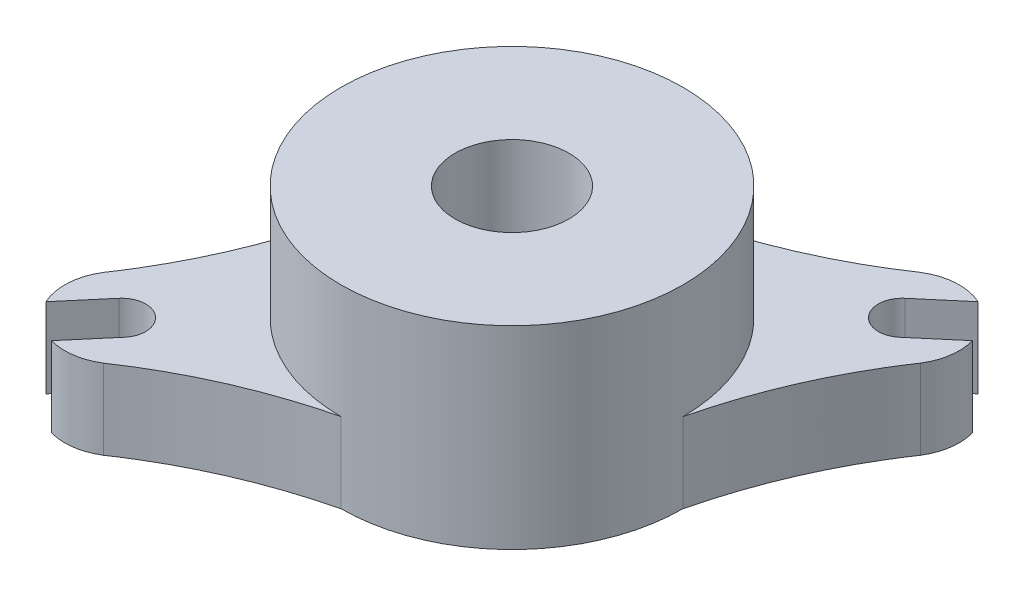
ISO-10303-21;
HEADER;
FILE_DESCRIPTION(('STEP AP214'),'2;1');
FILE_NAME('part.step','',(''),(''),'','','');
FILE_SCHEMA(('AUTOMOTIVE_DESIGN { 1 0 10303 214 1 1 1 1 }'));
ENDSEC;
DATA;
#1=APPLICATION_CONTEXT('core data for automotive mechanical design processes');
#2=APPLICATION_PROTOCOL_DEFINITION('international standard','automotive_design',2000,#1);
#3=PRODUCT_CONTEXT('',#1,'mechanical');
#4=PRODUCT('Part','Part','',(#3));
#5=PRODUCT_RELATED_PRODUCT_CATEGORY('part','',(#4));
#6=PRODUCT_DEFINITION_FORMATION('','',#4);
#7=PRODUCT_DEFINITION_CONTEXT('part definition',#1,'design');
#8=PRODUCT_DEFINITION('design','',#6,#7);
#9=PRODUCT_DEFINITION_SHAPE('','',#8);
#10=(LENGTH_UNIT() NAMED_UNIT(*) SI_UNIT(.MILLI.,.METRE.));
#11=(NAMED_UNIT(*) PLANE_ANGLE_UNIT() SI_UNIT($,.RADIAN.));
#12=(NAMED_UNIT(*) SI_UNIT($,.STERADIAN.) SOLID_ANGLE_UNIT());
#13=UNCERTAINTY_MEASURE_WITH_UNIT(LENGTH_MEASURE(1.E-05),#10,'distance_accuracy_value','');
#14=(GEOMETRIC_REPRESENTATION_CONTEXT(3) GLOBAL_UNCERTAINTY_ASSIGNED_CONTEXT((#13)) GLOBAL_UNIT_ASSIGNED_CONTEXT((#10,
#11,#12)) REPRESENTATION_CONTEXT('',''));
#15=CARTESIAN_POINT('',(0.,0.,0.));
#16=DIRECTION('',(0.,0.,1.));
#17=DIRECTION('',(1.,0.,0.));
#18=AXIS2_PLACEMENT_3D('',#15,#16,#17);
#19=CARTESIAN_POINT('',(0.,0.,0.));
#20=DIRECTION('',(0.,1.,0.));
#21=DIRECTION('',(0.,0.,1.));
#22=AXIS2_PLACEMENT_3D('',#19,#20,#21);
#23=PLANE('',#22);
#24=CARTESIAN_POINT('',(0.,0.,0.));
#25=DIRECTION('',(0.,1.,0.));
#26=DIRECTION('',(0.,0.,1.));
#27=AXIS2_PLACEMENT_3D('',#24,#25,#26);
#28=CIRCLE('',#27,6.35);
#29=CARTESIAN_POINT('',(0.,0.,6.35));
#30=VERTEX_POINT('',#29);
#31=EDGE_CURVE('E256',#30,#30,#28,.T.);
#32=ORIENTED_EDGE('',*,*,#31,.T.);
#33=EDGE_LOOP('',(#32));
#34=FACE_BOUND('',#33,.T.);
#35=DIRECTION('',(-0.647199999999998,0.,0.762320247664984));
#36=VECTOR('',#35,1.);
#37=CARTESIAN_POINT('',(0.125921181269016,0.,0.10690544920843));
#38=LINE('',#37,#36);
#39=CARTESIAN_POINT('',(-19.6991117124648,0.,23.4583022129873));
#40=VERTEX_POINT('',#39);
#41=CARTESIAN_POINT('',(-23.4287816746479,0.,27.8513846129873));
#42=VERTEX_POINT('',#41);
#43=EDGE_CURVE('E151',#40,#42,#38,.T.);
#44=ORIENTED_EDGE('',*,*,#43,.F.);
#45=CARTESIAN_POINT('',(-21.7322198129874,0.,21.7322198129873));
#46=DIRECTION('',(0.,1.,0.));
#47=DIRECTION('',(0.,0.,1.));
#48=AXIS2_PLACEMENT_3D('',#45,#46,#47);
#49=CIRCLE('',#48,2.667);
#50=CARTESIAN_POINT('',(-23.7653279135099,0.,20.0061374129873));
#51=VERTEX_POINT('',#50);
#52=EDGE_CURVE('E163',#40,#51,#49,.T.);
#53=ORIENTED_EDGE('',*,*,#52,.T.);
#54=DIRECTION('',(-0.647199999999998,0.,0.762320247664985));
#55=VECTOR('',#54,1.);
#56=CARTESIAN_POINT('',(-3.94029501977602,0.,-3.34525935079157));
#57=LINE('',#56,#55);
#58=CARTESIAN_POINT('',(-27.4949978756929,0.,24.3992198129874));
#59=VERTEX_POINT('',#58);
#60=EDGE_CURVE('E157',#51,#59,#57,.T.);
#61=ORIENTED_EDGE('',*,*,#60,.T.);
#62=CARTESIAN_POINT('',(-21.7322198129874,0.,21.7322198129873));
#63=DIRECTION('',(0.,1.,0.));
#64=DIRECTION('',(0.,0.,1.));
#65=AXIS2_PLACEMENT_3D('',#62,#63,#64);
#66=CIRCLE('',#65,6.35);
#67=CARTESIAN_POINT('',(-27.124937251061,0.,18.3794450467532));
#68=VERTEX_POINT('',#67);
#69=EDGE_CURVE('E175',#68,#59,#66,.T.);
#70=ORIENTED_EDGE('',*,*,#69,.F.);
#71=CARTESIAN_POINT('',(-19.05,0.,0.));
#72=CARTESIAN_POINT('',(-21.5258002791189,0.,10.0975448852474));
#73=CARTESIAN_POINT('',(-27.124937251061,0.,18.3794450467532));
#74=B_SPLINE_CURVE_WITH_KNOTS('',2,(#71,#72,#73),.UNSPECIFIED.,.F.,.F.,(3,3),(0.,
0.663461898278873),.UNSPECIFIED.);
#75=CARTESIAN_POINT('',(-19.05,0.,0.));
#76=VERTEX_POINT('',#75);
#77=EDGE_CURVE('E230',#76,#68,#74,.T.);
#78=ORIENTED_EDGE('',*,*,#77,.F.);
#79=CARTESIAN_POINT('',(0.,0.,0.));
#80=DIRECTION('',(0.,1.,0.));
#81=DIRECTION('',(0.,0.,1.));
#82=AXIS2_PLACEMENT_3D('',#79,#80,#81);
#83=CIRCLE('',#82,19.05);
#84=CARTESIAN_POINT('',(0.,0.,-19.05));
#85=VERTEX_POINT('',#84);
#86=EDGE_CURVE('E222',#85,#76,#83,.T.);
#87=ORIENTED_EDGE('',*,*,#86,.F.);
#88=CARTESIAN_POINT('',(0.,0.,-19.05));
#89=CARTESIAN_POINT('',(10.0975448852474,0.,-21.5258002791189));
#90=CARTESIAN_POINT('',(18.3794450467532,0.,-27.124937251061));
#91=B_SPLINE_CURVE_WITH_KNOTS('',2,(#88,#89,#90),.UNSPECIFIED.,.F.,.F.,(3,3),(0.,
0.663461898278873),.UNSPECIFIED.);
#92=CARTESIAN_POINT('',(18.3794450467532,0.,-27.124937251061));
#93=VERTEX_POINT('',#92);
#94=EDGE_CURVE('E219',#85,#93,#91,.T.);
#95=ORIENTED_EDGE('',*,*,#94,.T.);
#96=CARTESIAN_POINT('',(21.7322198129873,0.,-21.7322198129874));
#97=DIRECTION('',(0.,1.,0.));
#98=DIRECTION('',(0.,0.,1.));
#99=AXIS2_PLACEMENT_3D('',#96,#97,#98);
#100=CIRCLE('',#99,6.35);
#101=CARTESIAN_POINT('',(24.3992198129873,0.,-27.4949978756929));
#102=VERTEX_POINT('',#101);
#103=EDGE_CURVE('E214',#102,#93,#100,.T.);
#104=ORIENTED_EDGE('',*,*,#103,.F.);
#105=DIRECTION('',(0.762320247664982,0.,-0.647200000000001));
#106=VECTOR('',#105,1.);
#107=CARTESIAN_POINT('',(-3.34525935079151,0.,-3.94029501977592));
#108=LINE('',#107,#106);
#109=CARTESIAN_POINT('',(20.0061374129873,0.,-23.7653279135099));
#110=VERTEX_POINT('',#109);
#111=EDGE_CURVE('E386',#110,#102,#108,.T.);
#112=ORIENTED_EDGE('',*,*,#111,.F.);
#113=CARTESIAN_POINT('',(21.7322198129873,0.,-21.7322198129874));
#114=DIRECTION('',(0.,1.,0.));
#115=DIRECTION('',(0.,0.,1.));
#116=AXIS2_PLACEMENT_3D('',#113,#114,#115);
#117=CIRCLE('',#116,2.667);
#118=CARTESIAN_POINT('',(23.4583022129873,0.,-19.6991117124649));
#119=VERTEX_POINT('',#118);
#120=EDGE_CURVE('E169',#110,#119,#117,.T.);
#121=ORIENTED_EDGE('',*,*,#120,.T.);
#122=DIRECTION('',(-0.762320247664981,0.,0.647200000000002));
#123=VECTOR('',#122,1.);
#124=CARTESIAN_POINT('',(0.106905449208518,0.,0.125921181269117));
#125=LINE('',#124,#123);
#126=CARTESIAN_POINT('',(27.8513846129873,0.,-23.4287816746479));
#127=VERTEX_POINT('',#126);
#128=EDGE_CURVE('E218',#127,#119,#125,.T.);
#129=ORIENTED_EDGE('',*,*,#128,.F.);
#130=CARTESIAN_POINT('',(27.124937251061,0.,-18.3794450467533));
#131=VERTEX_POINT('',#130);
#132=EDGE_CURVE('E203',#131,#127,#100,.T.);
#133=ORIENTED_EDGE('',*,*,#132,.F.);
#134=CARTESIAN_POINT('',(19.0499999999999,0.,0.));
#135=CARTESIAN_POINT('',(21.5258002791189,0.,-10.0975448852475));
#136=CARTESIAN_POINT('',(27.124937251061,0.,-18.3794450467533));
#137=B_SPLINE_CURVE_WITH_KNOTS('',2,(#134,#135,#136),.UNSPECIFIED.,.F.,.F.,(3,3),(0.,
0.663461898278873),.UNSPECIFIED.);
#138=CARTESIAN_POINT('',(19.05,0.,0.));
#139=VERTEX_POINT('',#138);
#140=EDGE_CURVE('E209',#139,#131,#137,.T.);
#141=ORIENTED_EDGE('',*,*,#140,.F.);
#142=CARTESIAN_POINT('',(0.,0.,19.05));
#143=VERTEX_POINT('',#142);
#144=EDGE_CURVE('E215',#143,#139,#83,.T.);
#145=ORIENTED_EDGE('',*,*,#144,.F.);
#146=CARTESIAN_POINT('',(0.,0.,19.0499999999999));
#147=CARTESIAN_POINT('',(-10.0975448852475,0.,21.5258002791188));
#148=CARTESIAN_POINT('',(-18.3794450467532,0.,27.1249372510609));
#149=B_SPLINE_CURVE_WITH_KNOTS('',2,(#146,#147,#148),.UNSPECIFIED.,.F.,.F.,(3,3),(0.,
0.663461898278873),.UNSPECIFIED.);
#150=CARTESIAN_POINT('',(-18.3794450467532,0.,27.124937251061));
#151=VERTEX_POINT('',#150);
#152=EDGE_CURVE('E170',#143,#151,#149,.T.);
#153=ORIENTED_EDGE('',*,*,#152,.T.);
#154=EDGE_CURVE('E165',#42,#151,#66,.T.);
#155=ORIENTED_EDGE('',*,*,#154,.F.);
#156=EDGE_LOOP('',(#44,#53,#61,#70,#78,#87,#95,#104,#112,#121,#129,#133,#141,#145,#153,#155));
#157=FACE_BOUND('',#156,.T.);
#158=ADVANCED_FACE('F38',(#34,#157),#23,.F.);
#159=CARTESIAN_POINT('',(-21.7322198129874,21.59,21.7322198129873));
#160=DIRECTION('',(0.,-1.,0.));
#161=DIRECTION('',(0.,0.,-1.));
#162=AXIS2_PLACEMENT_3D('',#159,#160,#161);
#163=CYLINDRICAL_SURFACE('',#162,6.35);
#164=DIRECTION('',(0.,1.,0.));
#165=VECTOR('',#164,1.);
#166=CARTESIAN_POINT('',(-23.4287816746479,0.,27.8513846129873));
#167=LINE('',#166,#165);
#168=CARTESIAN_POINT('',(-23.4287816746479,8.89,27.8513846129873));
#169=VERTEX_POINT('',#168);
#170=EDGE_CURVE('E61',#42,#169,#167,.T.);
#171=ORIENTED_EDGE('',*,*,#170,.F.);
#172=ORIENTED_EDGE('',*,*,#154,.T.);
#173=DIRECTION('',(0.,-1.,0.));
#174=VECTOR('',#173,1.);
#175=CARTESIAN_POINT('',(-18.3794450467532,21.59,27.124937251061));
#176=LINE('',#175,#174);
#177=CARTESIAN_POINT('',(-18.3794450467532,8.89,27.1249372510609));
#178=VERTEX_POINT('',#177);
#179=EDGE_CURVE('E183',#178,#151,#176,.T.);
#180=ORIENTED_EDGE('',*,*,#179,.F.);
#181=CARTESIAN_POINT('',(-21.7322198129874,8.89,21.7322198129873));
#182=DIRECTION('',(0.,1.,0.));
#183=DIRECTION('',(0.,0.,1.));
#184=AXIS2_PLACEMENT_3D('',#181,#182,#183);
#185=CIRCLE('',#184,6.35);
#186=EDGE_CURVE('E276',#169,#178,#185,.T.);
#187=ORIENTED_EDGE('',*,*,#186,.F.);
#188=EDGE_LOOP('',(#171,#172,#180,#187));
#189=FACE_BOUND('',#188,.T.);
#190=ADVANCED_FACE('F246',(#189),#163,.T.);
#191=CARTESIAN_POINT('',(0.,8.89,0.));
#192=DIRECTION('',(0.,1.,0.));
#193=DIRECTION('',(0.,0.,1.));
#194=AXIS2_PLACEMENT_3D('',#191,#192,#193);
#195=PLANE('',#194);
#196=CARTESIAN_POINT('',(-21.7322198129874,8.89,21.7322198129873));
#197=DIRECTION('',(0.,1.,0.));
#198=DIRECTION('',(0.,0.,1.));
#199=AXIS2_PLACEMENT_3D('',#196,#197,#198);
#200=CIRCLE('',#199,2.667);
#201=CARTESIAN_POINT('',(-23.7653279135099,8.89,20.0061374129873));
#202=VERTEX_POINT('',#201);
#203=CARTESIAN_POINT('',(-19.6991117124648,8.89,23.4583022129873));
#204=VERTEX_POINT('',#203);
#205=EDGE_CURVE('E258',#202,#204,#200,.F.);
#206=ORIENTED_EDGE('',*,*,#205,.T.);
#207=DIRECTION('',(-0.647199999999998,0.,0.762320247664984));
#208=VECTOR('',#207,1.);
#209=CARTESIAN_POINT('',(0.125921181269016,8.89,0.10690544920843));
#210=LINE('',#209,#208);
#211=EDGE_CURVE('E152',#204,#169,#210,.T.);
#212=ORIENTED_EDGE('',*,*,#211,.T.);
#213=ORIENTED_EDGE('',*,*,#186,.T.);
#214=CARTESIAN_POINT('',(-18.3794450467532,8.89,27.1249372510609));
#215=CARTESIAN_POINT('',(-10.0975448852475,8.89,21.5258002791188));
#216=CARTESIAN_POINT('',(0.,8.89,19.0499999999999));
#217=B_SPLINE_CURVE_WITH_KNOTS('',2,(#214,#215,#216),.UNSPECIFIED.,.F.,.F.,(3,3),(0.,
0.663461898278873),.UNSPECIFIED.);
#218=CARTESIAN_POINT('',(0.,8.89,19.0499999999999));
#219=VERTEX_POINT('',#218);
#220=EDGE_CURVE('E254',#178,#219,#217,.T.);
#221=ORIENTED_EDGE('',*,*,#220,.T.);
#222=CARTESIAN_POINT('',(0.,8.89,0.));
#223=DIRECTION('',(0.,1.,0.));
#224=DIRECTION('',(0.,0.,1.));
#225=AXIS2_PLACEMENT_3D('',#222,#223,#224);
#226=CIRCLE('',#225,19.05);
#227=CARTESIAN_POINT('',(-19.05,8.89,0.));
#228=VERTEX_POINT('',#227);
#229=EDGE_CURVE('E277',#228,#219,#226,.T.);
#230=ORIENTED_EDGE('',*,*,#229,.F.);
#231=CARTESIAN_POINT('',(-19.05,8.89,0.));
#232=CARTESIAN_POINT('',(-21.5258002791189,8.89,10.0975448852474));
#233=CARTESIAN_POINT('',(-27.124937251061,8.89,18.3794450467532));
#234=B_SPLINE_CURVE_WITH_KNOTS('',2,(#231,#232,#233),.UNSPECIFIED.,.F.,.F.,(3,3),(0.,
0.663461898278873),.UNSPECIFIED.);
#235=CARTESIAN_POINT('',(-27.124937251061,8.89,18.3794450467532));
#236=VERTEX_POINT('',#235);
#237=EDGE_CURVE('E272',#228,#236,#234,.T.);
#238=ORIENTED_EDGE('',*,*,#237,.T.);
#239=CARTESIAN_POINT('',(-27.4949978756929,8.89,24.3992198129874));
#240=VERTEX_POINT('',#239);
#241=EDGE_CURVE('E279',#236,#240,#185,.T.);
#242=ORIENTED_EDGE('',*,*,#241,.T.);
#243=DIRECTION('',(-0.647199999999998,0.,0.762320247664985));
#244=VECTOR('',#243,1.);
#245=CARTESIAN_POINT('',(-3.94029501977602,8.89,-3.34525935079157));
#246=LINE('',#245,#244);
#247=EDGE_CURVE('E166',#202,#240,#246,.T.);
#248=ORIENTED_EDGE('',*,*,#247,.F.);
#249=EDGE_LOOP('',(#206,#212,#213,#221,#230,#238,#242,#248));
#250=FACE_BOUND('',#249,.T.);
#251=ADVANCED_FACE('F319',(#250),#195,.T.);
#252=CARTESIAN_POINT('',(21.7322198129873,21.59,-21.7322198129874));
#253=DIRECTION('',(0.,-1.,0.));
#254=DIRECTION('',(0.,0.,-1.));
#255=AXIS2_PLACEMENT_3D('',#252,#253,#254);
#256=CYLINDRICAL_SURFACE('',#255,6.35);
#257=DIRECTION('',(0.,1.,0.));
#258=VECTOR('',#257,1.);
#259=CARTESIAN_POINT('',(27.8513846129873,0.,-23.4287816746479));
#260=LINE('',#259,#258);
#261=CARTESIAN_POINT('',(27.8513846129873,8.89,-23.4287816746479));
#262=VERTEX_POINT('',#261);
#263=EDGE_CURVE('E389',#127,#262,#260,.T.);
#264=ORIENTED_EDGE('',*,*,#263,.T.);
#265=CARTESIAN_POINT('',(21.7322198129873,8.89,-21.7322198129874));
#266=DIRECTION('',(0.,1.,0.));
#267=DIRECTION('',(0.,0.,1.));
#268=AXIS2_PLACEMENT_3D('',#265,#266,#267);
#269=CIRCLE('',#268,6.35);
#270=CARTESIAN_POINT('',(27.124937251061,8.89,-18.3794450467533));
#271=VERTEX_POINT('',#270);
#272=EDGE_CURVE('E205',#271,#262,#269,.T.);
#273=ORIENTED_EDGE('',*,*,#272,.F.);
#274=DIRECTION('',(0.,-1.,0.));
#275=VECTOR('',#274,1.);
#276=CARTESIAN_POINT('',(27.124937251061,21.59,-18.3794450467533));
#277=LINE('',#276,#275);
#278=EDGE_CURVE('E46',#271,#131,#277,.T.);
#279=ORIENTED_EDGE('',*,*,#278,.T.);
#280=ORIENTED_EDGE('',*,*,#132,.T.);
#281=EDGE_LOOP('',(#264,#273,#279,#280));
#282=FACE_BOUND('',#281,.T.);
#283=ADVANCED_FACE('F201',(#282),#256,.T.);
#284=DIRECTION('',(0.,1.,0.));
#285=VECTOR('',#284,1.);
#286=CARTESIAN_POINT('',(24.3992198129873,0.,-27.4949978756929));
#287=LINE('',#286,#285);
#288=CARTESIAN_POINT('',(24.3992198129873,8.89,-27.4949978756929));
#289=VERTEX_POINT('',#288);
#290=EDGE_CURVE('E400',#102,#289,#287,.T.);
#291=ORIENTED_EDGE('',*,*,#290,.F.);
#292=ORIENTED_EDGE('',*,*,#103,.T.);
#293=DIRECTION('',(0.,-1.,0.));
#294=VECTOR('',#293,1.);
#295=CARTESIAN_POINT('',(18.3794450467532,21.59,-27.124937251061));
#296=LINE('',#295,#294);
#297=CARTESIAN_POINT('',(18.3794450467532,8.89,-27.124937251061));
#298=VERTEX_POINT('',#297);
#299=EDGE_CURVE('E193',#298,#93,#296,.T.);
#300=ORIENTED_EDGE('',*,*,#299,.F.);
#301=EDGE_CURVE('E408',#289,#298,#269,.T.);
#302=ORIENTED_EDGE('',*,*,#301,.F.);
#303=EDGE_LOOP('',(#291,#292,#300,#302));
#304=FACE_BOUND('',#303,.T.);
#305=ADVANCED_FACE('F318',(#304),#256,.T.);
#306=CARTESIAN_POINT('',(21.7322198129873,21.59,-21.7322198129874));
#307=DIRECTION('',(0.,-1.,0.));
#308=DIRECTION('',(0.,0.,-1.));
#309=AXIS2_PLACEMENT_3D('',#306,#307,#308);
#310=CYLINDRICAL_SURFACE('',#309,2.667);
#311=CARTESIAN_POINT('',(21.7322198129873,8.89,-21.7322198129874));
#312=DIRECTION('',(0.,1.,0.));
#313=DIRECTION('',(0.,0.,1.));
#314=AXIS2_PLACEMENT_3D('',#311,#312,#313);
#315=CIRCLE('',#314,2.667);
#316=CARTESIAN_POINT('',(23.4583022129873,8.89,-19.6991117124649));
#317=VERTEX_POINT('',#316);
#318=CARTESIAN_POINT('',(20.0061374129873,8.89,-23.7653279135099));
#319=VERTEX_POINT('',#318);
#320=EDGE_CURVE('E281',#317,#319,#315,.F.);
#321=ORIENTED_EDGE('',*,*,#320,.F.);
#322=DIRECTION('',(0.,1.,0.));
#323=VECTOR('',#322,1.);
#324=CARTESIAN_POINT('',(23.4583022129873,0.,-19.6991117124649));
#325=LINE('',#324,#323);
#326=EDGE_CURVE('E394',#119,#317,#325,.T.);
#327=ORIENTED_EDGE('',*,*,#326,.F.);
#328=ORIENTED_EDGE('',*,*,#120,.F.);
#329=DIRECTION('',(0.,1.,0.));
#330=VECTOR('',#329,1.);
#331=CARTESIAN_POINT('',(20.0061374129873,0.,-23.7653279135099));
#332=LINE('',#331,#330);
#333=EDGE_CURVE('E397',#110,#319,#332,.T.);
#334=ORIENTED_EDGE('',*,*,#333,.T.);
#335=EDGE_LOOP('',(#321,#327,#328,#334));
#336=FACE_BOUND('',#335,.T.);
#337=ADVANCED_FACE('F346',(#336),#310,.F.);
#338=CARTESIAN_POINT('',(0.,8.89,0.));
#339=DIRECTION('',(0.,1.,0.));
#340=DIRECTION('',(0.,0.,1.));
#341=AXIS2_PLACEMENT_3D('',#338,#339,#340);
#342=PLANE('',#341);
#343=ORIENTED_EDGE('',*,*,#272,.T.);
#344=DIRECTION('',(-0.762320247664981,0.,0.647200000000002));
#345=VECTOR('',#344,1.);
#346=CARTESIAN_POINT('',(0.106905449208518,8.89,0.125921181269117));
#347=LINE('',#346,#345);
#348=EDGE_CURVE('E382',#262,#317,#347,.T.);
#349=ORIENTED_EDGE('',*,*,#348,.T.);
#350=ORIENTED_EDGE('',*,*,#320,.T.);
#351=DIRECTION('',(0.762320247664982,0.,-0.647200000000001));
#352=VECTOR('',#351,1.);
#353=CARTESIAN_POINT('',(-3.34525935079151,8.89,-3.94029501977592));
#354=LINE('',#353,#352);
#355=EDGE_CURVE('E387',#319,#289,#354,.T.);
#356=ORIENTED_EDGE('',*,*,#355,.T.);
#357=ORIENTED_EDGE('',*,*,#301,.T.);
#358=CARTESIAN_POINT('',(18.3794450467532,8.89,-27.124937251061));
#359=CARTESIAN_POINT('',(10.0975448852474,8.89,-21.5258002791189));
#360=CARTESIAN_POINT('',(0.,8.89,-19.05));
#361=B_SPLINE_CURVE_WITH_KNOTS('',2,(#358,#359,#360),.UNSPECIFIED.,.F.,.F.,(3,3),(0.,
0.663461898278873),.UNSPECIFIED.);
#362=CARTESIAN_POINT('',(0.,8.89,-19.05));
#363=VERTEX_POINT('',#362);
#364=EDGE_CURVE('E413',#298,#363,#361,.T.);
#365=ORIENTED_EDGE('',*,*,#364,.T.);
#366=CARTESIAN_POINT('',(0.,8.89,0.));
#367=DIRECTION('',(0.,1.,0.));
#368=DIRECTION('',(0.,0.,1.));
#369=AXIS2_PLACEMENT_3D('',#366,#367,#368);
#370=CIRCLE('',#369,19.05);
#371=CARTESIAN_POINT('',(19.0499999999999,8.89,0.));
#372=VERTEX_POINT('',#371);
#373=EDGE_CURVE('E396',#372,#363,#370,.T.);
#374=ORIENTED_EDGE('',*,*,#373,.F.);
#375=CARTESIAN_POINT('',(19.0499999999999,8.89,0.));
#376=CARTESIAN_POINT('',(21.5258002791189,8.89,-10.0975448852475));
#377=CARTESIAN_POINT('',(27.124937251061,8.89,-18.3794450467533));
#378=B_SPLINE_CURVE_WITH_KNOTS('',2,(#375,#376,#377),.UNSPECIFIED.,.F.,.F.,(3,3),(0.,
0.663461898278873),.UNSPECIFIED.);
#379=EDGE_CURVE('E404',#372,#271,#378,.T.);
#380=ORIENTED_EDGE('',*,*,#379,.T.);
#381=EDGE_LOOP('',(#343,#349,#350,#356,#357,#365,#374,#380));
#382=FACE_BOUND('',#381,.T.);
#383=ADVANCED_FACE('F349',(#382),#342,.T.);
#384=CARTESIAN_POINT('',(0.,21.59,0.));
#385=DIRECTION('',(0.,1.,0.));
#386=DIRECTION('',(0.,0.,1.));
#387=AXIS2_PLACEMENT_3D('',#384,#385,#386);
#388=PLANE('',#387);
#389=CARTESIAN_POINT('',(0.,21.59,0.));
#390=DIRECTION('',(0.,1.,0.));
#391=DIRECTION('',(0.,0.,1.));
#392=AXIS2_PLACEMENT_3D('',#389,#390,#391);
#393=CIRCLE('',#392,6.35);
#394=CARTESIAN_POINT('',(0.,21.59,6.35));
#395=VERTEX_POINT('',#394);
#396=EDGE_CURVE('E173',#395,#395,#393,.T.);
#397=ORIENTED_EDGE('',*,*,#396,.F.);
#398=EDGE_LOOP('',(#397));
#399=FACE_BOUND('',#398,.T.);
#400=CARTESIAN_POINT('',(0.,21.59,0.));
#401=DIRECTION('',(0.,1.,0.));
#402=DIRECTION('',(0.,0.,1.));
#403=AXIS2_PLACEMENT_3D('',#400,#401,#402);
#404=CIRCLE('',#403,19.05);
#405=CARTESIAN_POINT('',(0.,21.59,19.05));
#406=VERTEX_POINT('',#405);
#407=EDGE_CURVE('E184',#406,#406,#404,.T.);
#408=ORIENTED_EDGE('',*,*,#407,.T.);
#409=EDGE_LOOP('',(#408));
#410=FACE_BOUND('',#409,.T.);
#411=ADVANCED_FACE('F315',(#399,#410),#388,.T.);
#412=CARTESIAN_POINT('',(19.0499999999999,21.59,0.));
#413=CARTESIAN_POINT('',(21.5258002791189,21.59,-10.0975448852475));
#414=CARTESIAN_POINT('',(27.124937251061,21.59,-18.3794450467533));
#415=B_SPLINE_CURVE_WITH_KNOTS('',2,(#412,#413,#414),.UNSPECIFIED.,.F.,.F.,(3,3),(0.,
0.663461898278873),.UNSPECIFIED.);
#416=DIRECTION('',(0.,-1.,0.));
#417=VECTOR('',#416,1.);
#418=SURFACE_OF_LINEAR_EXTRUSION('',#415,#417);
#419=ORIENTED_EDGE('',*,*,#379,.F.);
#420=DIRECTION('',(0.,-1.,0.));
#421=VECTOR('',#420,1.);
#422=CARTESIAN_POINT('',(19.05,21.59,0.));
#423=LINE('',#422,#421);
#424=EDGE_CURVE('E11',#372,#139,#423,.T.);
#425=ORIENTED_EDGE('',*,*,#424,.T.);
#426=ORIENTED_EDGE('',*,*,#140,.T.);
#427=ORIENTED_EDGE('',*,*,#278,.F.);
#428=EDGE_LOOP('',(#419,#425,#426,#427));
#429=FACE_BOUND('',#428,.T.);
#430=ADVANCED_FACE('F210',(#429),#418,.F.);
#431=CARTESIAN_POINT('',(0.,21.59,-19.05));
#432=CARTESIAN_POINT('',(10.0975448852474,21.59,-21.5258002791189));
#433=CARTESIAN_POINT('',(18.3794450467532,21.59,-27.124937251061));
#434=B_SPLINE_CURVE_WITH_KNOTS('',2,(#431,#432,#433),.UNSPECIFIED.,.F.,.F.,(3,3),(0.,
0.663461898278873),.UNSPECIFIED.);
#435=DIRECTION('',(0.,-1.,0.));
#436=VECTOR('',#435,1.);
#437=SURFACE_OF_LINEAR_EXTRUSION('',#434,#436);
#438=DIRECTION('',(0.,-1.,0.));
#439=VECTOR('',#438,1.);
#440=CARTESIAN_POINT('',(0.,21.59,-19.05));
#441=LINE('',#440,#439);
#442=EDGE_CURVE('E191',#363,#85,#441,.T.);
#443=ORIENTED_EDGE('',*,*,#442,.F.);
#444=ORIENTED_EDGE('',*,*,#364,.F.);
#445=ORIENTED_EDGE('',*,*,#299,.T.);
#446=ORIENTED_EDGE('',*,*,#94,.F.);
#447=EDGE_LOOP('',(#443,#444,#445,#446));
#448=FACE_BOUND('',#447,.T.);
#449=ADVANCED_FACE('F314',(#448),#437,.T.);
#450=CARTESIAN_POINT('',(-19.05,21.59,0.));
#451=CARTESIAN_POINT('',(-21.5258002791189,21.59,10.0975448852474));
#452=CARTESIAN_POINT('',(-27.124937251061,21.59,18.3794450467532));
#453=B_SPLINE_CURVE_WITH_KNOTS('',2,(#450,#451,#452),.UNSPECIFIED.,.F.,.F.,(3,3),(0.,
0.663461898278873),.UNSPECIFIED.);
#454=DIRECTION('',(0.,-1.,0.));
#455=VECTOR('',#454,1.);
#456=SURFACE_OF_LINEAR_EXTRUSION('',#453,#455);
#457=ORIENTED_EDGE('',*,*,#237,.F.);
#458=DIRECTION('',(0.,-1.,0.));
#459=VECTOR('',#458,1.);
#460=CARTESIAN_POINT('',(-19.05,21.59,0.));
#461=LINE('',#460,#459);
#462=EDGE_CURVE('E189',#228,#76,#461,.T.);
#463=ORIENTED_EDGE('',*,*,#462,.T.);
#464=ORIENTED_EDGE('',*,*,#77,.T.);
#465=DIRECTION('',(0.,-1.,0.));
#466=VECTOR('',#465,1.);
#467=CARTESIAN_POINT('',(-27.124937251061,21.59,18.3794450467532));
#468=LINE('',#467,#466);
#469=EDGE_CURVE('E187',#236,#68,#468,.T.);
#470=ORIENTED_EDGE('',*,*,#469,.F.);
#471=EDGE_LOOP('',(#457,#463,#464,#470));
#472=FACE_BOUND('',#471,.T.);
#473=ADVANCED_FACE('F271',(#472),#456,.F.);
#474=ORIENTED_EDGE('',*,*,#69,.T.);
#475=DIRECTION('',(0.,1.,0.));
#476=VECTOR('',#475,1.);
#477=CARTESIAN_POINT('',(-27.4949978756929,0.,24.3992198129874));
#478=LINE('',#477,#476);
#479=EDGE_CURVE('E376',#59,#240,#478,.T.);
#480=ORIENTED_EDGE('',*,*,#479,.T.);
#481=ORIENTED_EDGE('',*,*,#241,.F.);
#482=ORIENTED_EDGE('',*,*,#469,.T.);
#483=EDGE_LOOP('',(#474,#480,#481,#482));
#484=FACE_BOUND('',#483,.T.);
#485=ADVANCED_FACE('F327',(#484),#163,.T.);
#486=CARTESIAN_POINT('',(-21.7322198129874,21.59,21.7322198129873));
#487=DIRECTION('',(0.,-1.,0.));
#488=DIRECTION('',(0.,0.,-1.));
#489=AXIS2_PLACEMENT_3D('',#486,#487,#488);
#490=CYLINDRICAL_SURFACE('',#489,2.667);
#491=DIRECTION('',(0.,1.,0.));
#492=VECTOR('',#491,1.);
#493=CARTESIAN_POINT('',(-19.6991117124648,0.,23.4583022129873));
#494=LINE('',#493,#492);
#495=EDGE_CURVE('E148',#40,#204,#494,.T.);
#496=ORIENTED_EDGE('',*,*,#495,.T.);
#497=ORIENTED_EDGE('',*,*,#205,.F.);
#498=DIRECTION('',(0.,1.,0.));
#499=VECTOR('',#498,1.);
#500=CARTESIAN_POINT('',(-23.7653279135099,0.,20.0061374129873));
#501=LINE('',#500,#499);
#502=EDGE_CURVE('E53',#51,#202,#501,.T.);
#503=ORIENTED_EDGE('',*,*,#502,.F.);
#504=ORIENTED_EDGE('',*,*,#52,.F.);
#505=EDGE_LOOP('',(#496,#497,#503,#504));
#506=FACE_BOUND('',#505,.T.);
#507=ADVANCED_FACE('F168',(#506),#490,.F.);
#508=CARTESIAN_POINT('',(0.,21.59,19.0499999999999));
#509=CARTESIAN_POINT('',(-10.0975448852475,21.59,21.5258002791188));
#510=CARTESIAN_POINT('',(-18.3794450467532,21.59,27.1249372510609));
#511=B_SPLINE_CURVE_WITH_KNOTS('',2,(#508,#509,#510),.UNSPECIFIED.,.F.,.F.,(3,3),(0.,
0.663461898278873),.UNSPECIFIED.);
#512=DIRECTION('',(0.,-1.,0.));
#513=VECTOR('',#512,1.);
#514=SURFACE_OF_LINEAR_EXTRUSION('',#511,#513);
#515=DIRECTION('',(0.,-1.,0.));
#516=VECTOR('',#515,1.);
#517=CARTESIAN_POINT('',(0.,21.59,19.05));
#518=LINE('',#517,#516);
#519=EDGE_CURVE('E181',#219,#143,#518,.T.);
#520=ORIENTED_EDGE('',*,*,#519,.F.);
#521=ORIENTED_EDGE('',*,*,#220,.F.);
#522=ORIENTED_EDGE('',*,*,#179,.T.);
#523=ORIENTED_EDGE('',*,*,#152,.F.);
#524=EDGE_LOOP('',(#520,#521,#522,#523));
#525=FACE_BOUND('',#524,.T.);
#526=ADVANCED_FACE('F252',(#525),#514,.T.);
#527=CARTESIAN_POINT('',(0.,21.59,0.));
#528=DIRECTION('',(0.,-1.,0.));
#529=DIRECTION('',(0.,0.,-1.));
#530=AXIS2_PLACEMENT_3D('',#527,#528,#529);
#531=CYLINDRICAL_SURFACE('',#530,19.05);
#532=ORIENTED_EDGE('',*,*,#424,.F.);
#533=ORIENTED_EDGE('',*,*,#373,.T.);
#534=ORIENTED_EDGE('',*,*,#442,.T.);
#535=ORIENTED_EDGE('',*,*,#86,.T.);
#536=ORIENTED_EDGE('',*,*,#462,.F.);
#537=ORIENTED_EDGE('',*,*,#229,.T.);
#538=ORIENTED_EDGE('',*,*,#519,.T.);
#539=ORIENTED_EDGE('',*,*,#144,.T.);
#540=EDGE_LOOP('',(#532,#533,#534,#535,#536,#537,#538,#539));
#541=FACE_BOUND('',#540,.T.);
#542=ORIENTED_EDGE('',*,*,#407,.F.);
#543=EDGE_LOOP('',(#542));
#544=FACE_BOUND('',#543,.T.);
#545=ADVANCED_FACE('F264',(#541,#544),#531,.T.);
#546=CARTESIAN_POINT('',(0.,21.59,0.));
#547=DIRECTION('',(0.,-1.,0.));
#548=DIRECTION('',(0.,0.,-1.));
#549=AXIS2_PLACEMENT_3D('',#546,#547,#548);
#550=CYLINDRICAL_SURFACE('',#549,6.35);
#551=ORIENTED_EDGE('',*,*,#396,.T.);
#552=EDGE_LOOP('',(#551));
#553=FACE_BOUND('',#552,.T.);
#554=ORIENTED_EDGE('',*,*,#31,.F.);
#555=EDGE_LOOP('',(#554));
#556=FACE_BOUND('',#555,.T.);
#557=ADVANCED_FACE('F40',(#553,#556),#550,.F.);
#558=CARTESIAN_POINT('',(-3.34525935079151,0.,-3.94029501977592));
#559=DIRECTION('',(0.647200000000001,0.,0.762320247664981));
#560=DIRECTION('',(0.762320247664982,0.,-0.647200000000001));
#561=AXIS2_PLACEMENT_3D('',#558,#559,#560);
#562=PLANE('',#561);
#563=ORIENTED_EDGE('',*,*,#355,.F.);
#564=ORIENTED_EDGE('',*,*,#333,.F.);
#565=ORIENTED_EDGE('',*,*,#111,.T.);
#566=ORIENTED_EDGE('',*,*,#290,.T.);
#567=EDGE_LOOP('',(#563,#564,#565,#566));
#568=FACE_BOUND('',#567,.T.);
#569=ADVANCED_FACE('F366',(#568),#562,.T.);
#570=CARTESIAN_POINT('',(0.106905449208518,0.,0.125921181269117));
#571=DIRECTION('',(-0.647200000000002,0.,-0.76232024766498));
#572=DIRECTION('',(-0.762320247664981,0.,0.647200000000002));
#573=AXIS2_PLACEMENT_3D('',#570,#571,#572);
#574=PLANE('',#573);
#575=ORIENTED_EDGE('',*,*,#348,.F.);
#576=ORIENTED_EDGE('',*,*,#263,.F.);
#577=ORIENTED_EDGE('',*,*,#128,.T.);
#578=ORIENTED_EDGE('',*,*,#326,.T.);
#579=EDGE_LOOP('',(#575,#576,#577,#578));
#580=FACE_BOUND('',#579,.T.);
#581=ADVANCED_FACE('F362',(#580),#574,.T.);
#582=CARTESIAN_POINT('',(-3.94029501977602,0.,-3.34525935079157));
#583=DIRECTION('',(-0.762320247664984,0.,-0.647199999999997));
#584=DIRECTION('',(-0.647199999999998,0.,0.762320247664985));
#585=AXIS2_PLACEMENT_3D('',#582,#583,#584);
#586=PLANE('',#585);
#587=ORIENTED_EDGE('',*,*,#247,.T.);
#588=ORIENTED_EDGE('',*,*,#479,.F.);
#589=ORIENTED_EDGE('',*,*,#60,.F.);
#590=ORIENTED_EDGE('',*,*,#502,.T.);
#591=EDGE_LOOP('',(#587,#588,#589,#590));
#592=FACE_BOUND('',#591,.T.);
#593=ADVANCED_FACE('F365',(#592),#586,.F.);
#594=CARTESIAN_POINT('',(0.125921181269016,0.,0.10690544920843));
#595=DIRECTION('',(-0.762320247664984,0.,-0.647199999999998));
#596=DIRECTION('',(-0.647199999999998,0.,0.762320247664984));
#597=AXIS2_PLACEMENT_3D('',#594,#595,#596);
#598=PLANE('',#597);
#599=ORIENTED_EDGE('',*,*,#211,.F.);
#600=ORIENTED_EDGE('',*,*,#495,.F.);
#601=ORIENTED_EDGE('',*,*,#43,.T.);
#602=ORIENTED_EDGE('',*,*,#170,.T.);
#603=EDGE_LOOP('',(#599,#600,#601,#602));
#604=FACE_BOUND('',#603,.T.);
#605=ADVANCED_FACE('F150',(#604),#598,.T.);
#606=CLOSED_SHELL('',(#158,#190,#251,#283,#305,#337,#383,#411,#430,#449,#473,#485,#507,#526,
#545,#557,#569,#581,#593,#605));
#607=MANIFOLD_SOLID_BREP('B2',#606);
#608=ADVANCED_BREP_SHAPE_REPRESENTATION('',(#18,#607),#14);
#609=SHAPE_DEFINITION_REPRESENTATION(#9,#608);
ENDSEC;
END-ISO-10303-21;
